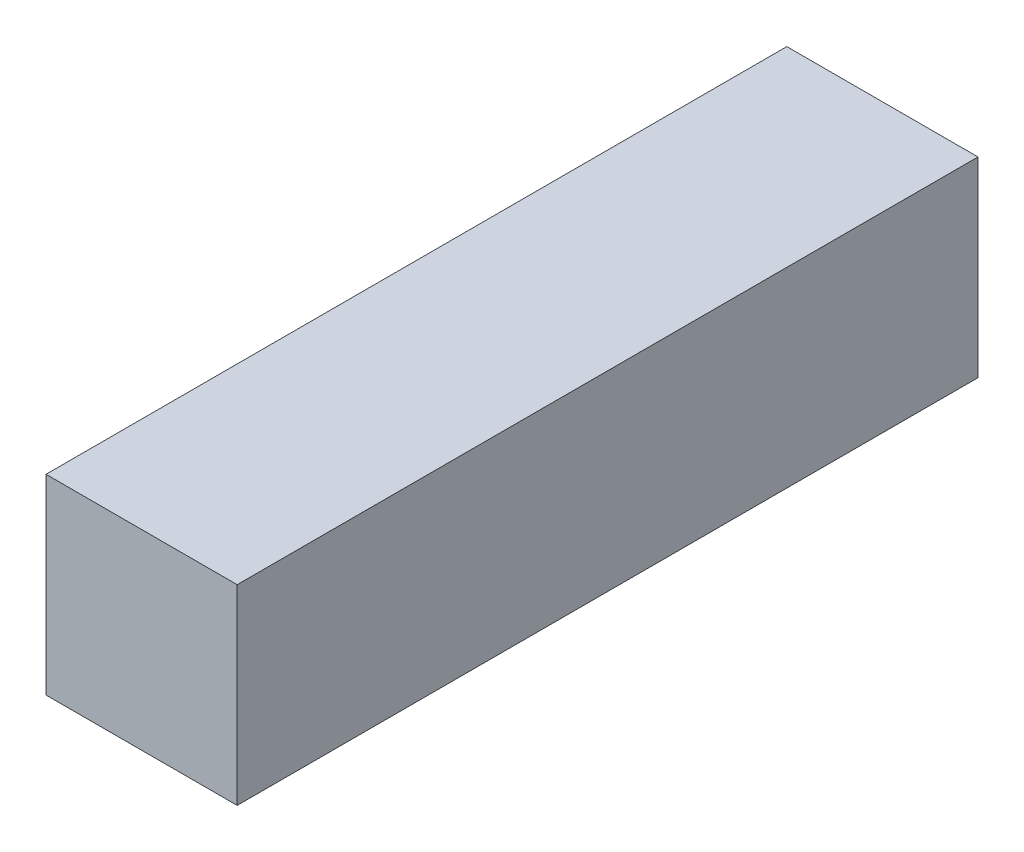
ISO-10303-21;
HEADER;
FILE_DESCRIPTION(('STEP AP214'),'2;1');
FILE_NAME('part.step','',(''),(''),'','','');
FILE_SCHEMA(('AUTOMOTIVE_DESIGN { 1 0 10303 214 1 1 1 1 }'));
ENDSEC;
DATA;
#1=APPLICATION_CONTEXT('core data for automotive mechanical design processes');
#2=APPLICATION_PROTOCOL_DEFINITION('international standard','automotive_design',2000,#1);
#3=PRODUCT_CONTEXT('',#1,'mechanical');
#4=PRODUCT('Part','Part','',(#3));
#5=PRODUCT_RELATED_PRODUCT_CATEGORY('part','',(#4));
#6=PRODUCT_DEFINITION_FORMATION('','',#4);
#7=PRODUCT_DEFINITION_CONTEXT('part definition',#1,'design');
#8=PRODUCT_DEFINITION('design','',#6,#7);
#9=PRODUCT_DEFINITION_SHAPE('','',#8);
#10=(LENGTH_UNIT() NAMED_UNIT(*) SI_UNIT(.MILLI.,.METRE.));
#11=(NAMED_UNIT(*) PLANE_ANGLE_UNIT() SI_UNIT($,.RADIAN.));
#12=(NAMED_UNIT(*) SI_UNIT($,.STERADIAN.) SOLID_ANGLE_UNIT());
#13=UNCERTAINTY_MEASURE_WITH_UNIT(LENGTH_MEASURE(1.E-05),#10,'distance_accuracy_value','');
#14=(GEOMETRIC_REPRESENTATION_CONTEXT(3) GLOBAL_UNCERTAINTY_ASSIGNED_CONTEXT((#13)) GLOBAL_UNIT_ASSIGNED_CONTEXT((#10,
#11,#12)) REPRESENTATION_CONTEXT('',''));
#15=CARTESIAN_POINT('',(0.,0.,0.));
#16=DIRECTION('',(0.,0.,1.));
#17=DIRECTION('',(1.,0.,0.));
#18=AXIS2_PLACEMENT_3D('',#15,#16,#17);
#19=CARTESIAN_POINT('',(-1.00000000000003,3.,-7.25));
#20=DIRECTION('',(-1.,0.,0.));
#21=DIRECTION('',(0.,0.,1.));
#22=AXIS2_PLACEMENT_3D('',#19,#20,#21);
#23=PLANE('',#22);
#24=DIRECTION('',(0.,-1.,0.));
#25=VECTOR('',#24,1.);
#26=CARTESIAN_POINT('',(-0.99999999999997,3.,7.25000000000001));
#27=LINE('',#26,#25);
#28=CARTESIAN_POINT('',(-0.99999999999997,3.,7.25000000000001));
#29=VERTEX_POINT('',#28);
#30=CARTESIAN_POINT('',(-0.99999999999997,0.25,7.25000000000001));
#31=VERTEX_POINT('',#30);
#32=EDGE_CURVE('E147',#29,#31,#27,.T.);
#33=ORIENTED_EDGE('',*,*,#32,.T.);
#34=DIRECTION('',(0.,0.,1.));
#35=VECTOR('',#34,1.);
#36=CARTESIAN_POINT('',(-0.99999999999997,0.25,7.25000000000001));
#37=LINE('',#36,#35);
#38=CARTESIAN_POINT('',(-1.00000000000003,0.25,-7.25));
#39=VERTEX_POINT('',#38);
#40=EDGE_CURVE('E134',#39,#31,#37,.T.);
#41=ORIENTED_EDGE('',*,*,#40,.F.);
#42=DIRECTION('',(0.,-1.,0.));
#43=VECTOR('',#42,1.);
#44=CARTESIAN_POINT('',(-1.00000000000003,3.,-7.25));
#45=LINE('',#44,#43);
#46=CARTESIAN_POINT('',(-1.00000000000003,3.,-7.25));
#47=VERTEX_POINT('',#46);
#48=EDGE_CURVE('E11',#47,#39,#45,.T.);
#49=ORIENTED_EDGE('',*,*,#48,.F.);
#50=DIRECTION('',(0.,0.,-1.));
#51=VECTOR('',#50,1.);
#52=CARTESIAN_POINT('',(-1.00000000000003,3.,-7.25));
#53=LINE('',#52,#51);
#54=EDGE_CURVE('E151',#29,#47,#53,.T.);
#55=ORIENTED_EDGE('',*,*,#54,.F.);
#56=EDGE_LOOP('',(#33,#41,#49,#55));
#57=FACE_BOUND('',#56,.T.);
#58=ADVANCED_FACE('F37',(#57),#23,.F.);
#59=CARTESIAN_POINT('',(-2.00000000000003,3.,-7.25));
#60=DIRECTION('',(1.,0.,0.));
#61=DIRECTION('',(0.,0.,-1.));
#62=AXIS2_PLACEMENT_3D('',#59,#60,#61);
#63=PLANE('',#62);
#64=DIRECTION('',(0.,0.,1.));
#65=VECTOR('',#64,1.);
#66=CARTESIAN_POINT('',(-2.00000000000003,0.,-7.25));
#67=LINE('',#66,#65);
#68=CARTESIAN_POINT('',(-2.00000000000003,0.,-7.25));
#69=VERTEX_POINT('',#68);
#70=CARTESIAN_POINT('',(-2.00000000000003,0.,8.25000000000001));
#71=VERTEX_POINT('',#70);
#72=EDGE_CURVE('E187',#69,#71,#67,.T.);
#73=ORIENTED_EDGE('',*,*,#72,.T.);
#74=DIRECTION('',(0.,-1.,0.));
#75=VECTOR('',#74,1.);
#76=CARTESIAN_POINT('',(-2.00000000000003,3.,8.25000000000001));
#77=LINE('',#76,#75);
#78=CARTESIAN_POINT('',(-2.00000000000003,4.,8.25000000000001));
#79=VERTEX_POINT('',#78);
#80=EDGE_CURVE('E166',#79,#71,#77,.T.);
#81=ORIENTED_EDGE('',*,*,#80,.F.);
#82=DIRECTION('',(0.,0.,1.));
#83=VECTOR('',#82,1.);
#84=CARTESIAN_POINT('',(-2.00000000000003,4.,8.25000000000001));
#85=LINE('',#84,#83);
#86=CARTESIAN_POINT('',(-2.00000000000003,4.,-7.25));
#87=VERTEX_POINT('',#86);
#88=EDGE_CURVE('E221',#87,#79,#85,.T.);
#89=ORIENTED_EDGE('',*,*,#88,.F.);
#90=DIRECTION('',(0.,-1.,0.));
#91=VECTOR('',#90,1.);
#92=CARTESIAN_POINT('',(-2.00000000000003,3.,-7.25));
#93=LINE('',#92,#91);
#94=EDGE_CURVE('E45',#87,#69,#93,.T.);
#95=ORIENTED_EDGE('',*,*,#94,.T.);
#96=EDGE_LOOP('',(#73,#81,#89,#95));
#97=FACE_BOUND('',#96,.T.);
#98=ADVANCED_FACE('F237',(#97),#63,.F.);
#99=CARTESIAN_POINT('',(2.00000000000003,3.,8.25000000000001));
#100=DIRECTION('',(0.,0.,-1.));
#101=DIRECTION('',(-1.,0.,0.));
#102=AXIS2_PLACEMENT_3D('',#99,#100,#101);
#103=PLANE('',#102);
#104=DIRECTION('',(1.,0.,0.));
#105=VECTOR('',#104,1.);
#106=CARTESIAN_POINT('',(2.00000000000003,0.,8.25000000000001));
#107=LINE('',#106,#105);
#108=CARTESIAN_POINT('',(2.00000000000003,0.,8.25000000000001));
#109=VERTEX_POINT('',#108);
#110=EDGE_CURVE('E191',#71,#109,#107,.T.);
#111=ORIENTED_EDGE('',*,*,#110,.T.);
#112=DIRECTION('',(0.,-1.,0.));
#113=VECTOR('',#112,1.);
#114=CARTESIAN_POINT('',(2.00000000000003,3.,8.25000000000001));
#115=LINE('',#114,#113);
#116=CARTESIAN_POINT('',(2.00000000000003,4.,8.25000000000001));
#117=VERTEX_POINT('',#116);
#118=EDGE_CURVE('E164',#117,#109,#115,.T.);
#119=ORIENTED_EDGE('',*,*,#118,.F.);
#120=DIRECTION('',(1.,0.,0.));
#121=VECTOR('',#120,1.);
#122=CARTESIAN_POINT('',(2.00000000000003,4.,8.25000000000001));
#123=LINE('',#122,#121);
#124=EDGE_CURVE('E224',#79,#117,#123,.T.);
#125=ORIENTED_EDGE('',*,*,#124,.F.);
#126=ORIENTED_EDGE('',*,*,#80,.T.);
#127=EDGE_LOOP('',(#111,#119,#125,#126));
#128=FACE_BOUND('',#127,.T.);
#129=ADVANCED_FACE('F241',(#128),#103,.F.);
#130=CARTESIAN_POINT('',(2.00000000000003,3.,7.25));
#131=DIRECTION('',(-1.,0.,0.));
#132=DIRECTION('',(0.,0.,1.));
#133=AXIS2_PLACEMENT_3D('',#130,#131,#132);
#134=PLANE('',#133);
#135=DIRECTION('',(0.,0.,-1.));
#136=VECTOR('',#135,1.);
#137=CARTESIAN_POINT('',(2.00000000000003,0.,7.25));
#138=LINE('',#137,#136);
#139=CARTESIAN_POINT('',(2.00000000000003,0.,-7.25));
#140=VERTEX_POINT('',#139);
#141=EDGE_CURVE('E82',#109,#140,#138,.T.);
#142=ORIENTED_EDGE('',*,*,#141,.T.);
#143=DIRECTION('',(0.,-1.,0.));
#144=VECTOR('',#143,1.);
#145=CARTESIAN_POINT('',(2.00000000000003,3.,-7.25));
#146=LINE('',#145,#144);
#147=CARTESIAN_POINT('',(2.00000000000003,4.,-7.25));
#148=VERTEX_POINT('',#147);
#149=EDGE_CURVE('E162',#148,#140,#146,.T.);
#150=ORIENTED_EDGE('',*,*,#149,.F.);
#151=DIRECTION('',(0.,0.,-1.));
#152=VECTOR('',#151,1.);
#153=CARTESIAN_POINT('',(2.00000000000003,4.,-7.25));
#154=LINE('',#153,#152);
#155=EDGE_CURVE('E227',#117,#148,#154,.T.);
#156=ORIENTED_EDGE('',*,*,#155,.F.);
#157=ORIENTED_EDGE('',*,*,#118,.T.);
#158=EDGE_LOOP('',(#142,#150,#156,#157));
#159=FACE_BOUND('',#158,.T.);
#160=ADVANCED_FACE('F242',(#159),#134,.F.);
#161=CARTESIAN_POINT('',(1.00000000000003,3.,-7.25));
#162=DIRECTION('',(0.,0.,1.));
#163=DIRECTION('',(1.,0.,0.));
#164=AXIS2_PLACEMENT_3D('',#161,#162,#163);
#165=PLANE('',#164);
#166=DIRECTION('',(-1.,0.,0.));
#167=VECTOR('',#166,1.);
#168=CARTESIAN_POINT('',(1.00000000000003,0.,-7.25));
#169=LINE('',#168,#167);
#170=CARTESIAN_POINT('',(1.50000000000003,0.,-7.25));
#171=VERTEX_POINT('',#170);
#172=EDGE_CURVE('E159',#140,#171,#169,.T.);
#173=ORIENTED_EDGE('',*,*,#172,.T.);
#174=DIRECTION('',(0.,-1.,0.));
#175=VECTOR('',#174,1.);
#176=CARTESIAN_POINT('',(1.50000000000003,0.25,-7.25));
#177=LINE('',#176,#175);
#178=CARTESIAN_POINT('',(1.50000000000003,0.25,-7.25));
#179=VERTEX_POINT('',#178);
#180=EDGE_CURVE('E52',#179,#171,#177,.T.);
#181=ORIENTED_EDGE('',*,*,#180,.F.);
#182=DIRECTION('',(1.,0.,0.));
#183=VECTOR('',#182,1.);
#184=CARTESIAN_POINT('',(1.00000000000003,0.25,-7.25));
#185=LINE('',#184,#183);
#186=CARTESIAN_POINT('',(1.00000000000003,0.25,-7.25));
#187=VERTEX_POINT('',#186);
#188=EDGE_CURVE('E375',#187,#179,#185,.T.);
#189=ORIENTED_EDGE('',*,*,#188,.F.);
#190=DIRECTION('',(0.,-1.,0.));
#191=VECTOR('',#190,1.);
#192=CARTESIAN_POINT('',(1.00000000000003,3.,-7.25));
#193=LINE('',#192,#191);
#194=CARTESIAN_POINT('',(1.00000000000003,3.,-7.25));
#195=VERTEX_POINT('',#194);
#196=EDGE_CURVE('E154',#195,#187,#193,.T.);
#197=ORIENTED_EDGE('',*,*,#196,.F.);
#198=DIRECTION('',(-1.,0.,0.));
#199=VECTOR('',#198,1.);
#200=CARTESIAN_POINT('',(-2.00000000000003,3.,-7.25));
#201=LINE('',#200,#199);
#202=EDGE_CURVE('E182',#195,#47,#201,.T.);
#203=ORIENTED_EDGE('',*,*,#202,.T.);
#204=ORIENTED_EDGE('',*,*,#48,.T.);
#205=DIRECTION('',(1.,0.,0.));
#206=VECTOR('',#205,1.);
#207=CARTESIAN_POINT('',(-1.00000000000003,0.25,-7.25));
#208=LINE('',#207,#206);
#209=CARTESIAN_POINT('',(-1.50000000000003,0.25,-7.25));
#210=VERTEX_POINT('',#209);
#211=EDGE_CURVE('E140',#210,#39,#208,.T.);
#212=ORIENTED_EDGE('',*,*,#211,.F.);
#213=DIRECTION('',(0.,-1.,0.));
#214=VECTOR('',#213,1.);
#215=CARTESIAN_POINT('',(-1.50000000000003,0.25,-7.25));
#216=LINE('',#215,#214);
#217=CARTESIAN_POINT('',(-1.50000000000003,0.,-7.25));
#218=VERTEX_POINT('',#217);
#219=EDGE_CURVE('E213',#210,#218,#216,.T.);
#220=ORIENTED_EDGE('',*,*,#219,.T.);
#221=DIRECTION('',(-1.,0.,0.));
#222=VECTOR('',#221,1.);
#223=CARTESIAN_POINT('',(-2.00000000000003,0.,-7.25));
#224=LINE('',#223,#222);
#225=EDGE_CURVE('E185',#218,#69,#224,.T.);
#226=ORIENTED_EDGE('',*,*,#225,.T.);
#227=ORIENTED_EDGE('',*,*,#94,.F.);
#228=DIRECTION('',(-1.,0.,0.));
#229=VECTOR('',#228,1.);
#230=CARTESIAN_POINT('',(-2.00000000000003,4.,-7.25));
#231=LINE('',#230,#229);
#232=EDGE_CURVE('E188',#148,#87,#231,.T.);
#233=ORIENTED_EDGE('',*,*,#232,.F.);
#234=ORIENTED_EDGE('',*,*,#149,.T.);
#235=EDGE_LOOP('',(#173,#181,#189,#197,#203,#204,#212,#220,#226,#227,#233,#234));
#236=FACE_BOUND('',#235,.T.);
#237=ADVANCED_FACE('F196',(#236),#165,.F.);
#238=CARTESIAN_POINT('',(1.00000000000003,3.,7.25));
#239=DIRECTION('',(1.,0.,0.));
#240=DIRECTION('',(0.,0.,-1.));
#241=AXIS2_PLACEMENT_3D('',#238,#239,#240);
#242=PLANE('',#241);
#243=ORIENTED_EDGE('',*,*,#196,.T.);
#244=DIRECTION('',(0.,0.,-1.));
#245=VECTOR('',#244,1.);
#246=CARTESIAN_POINT('',(1.00000000000003,0.25,7.25));
#247=LINE('',#246,#245);
#248=CARTESIAN_POINT('',(1.00000000000003,0.25,7.25));
#249=VERTEX_POINT('',#248);
#250=EDGE_CURVE('E149',#249,#187,#247,.T.);
#251=ORIENTED_EDGE('',*,*,#250,.F.);
#252=DIRECTION('',(0.,-1.,0.));
#253=VECTOR('',#252,1.);
#254=CARTESIAN_POINT('',(1.00000000000003,3.,7.25));
#255=LINE('',#254,#253);
#256=CARTESIAN_POINT('',(1.00000000000003,3.,7.25));
#257=VERTEX_POINT('',#256);
#258=EDGE_CURVE('E61',#257,#249,#255,.T.);
#259=ORIENTED_EDGE('',*,*,#258,.F.);
#260=DIRECTION('',(0.,0.,1.));
#261=VECTOR('',#260,1.);
#262=CARTESIAN_POINT('',(1.00000000000003,3.,7.25));
#263=LINE('',#262,#261);
#264=EDGE_CURVE('E156',#195,#257,#263,.T.);
#265=ORIENTED_EDGE('',*,*,#264,.F.);
#266=EDGE_LOOP('',(#243,#251,#259,#265));
#267=FACE_BOUND('',#266,.T.);
#268=ADVANCED_FACE('F249',(#267),#242,.F.);
#269=CARTESIAN_POINT('',(-0.99999999999997,3.,7.25000000000001));
#270=DIRECTION('',(0.,0.,1.));
#271=DIRECTION('',(1.,0.,0.));
#272=AXIS2_PLACEMENT_3D('',#269,#270,#271);
#273=PLANE('',#272);
#274=ORIENTED_EDGE('',*,*,#258,.T.);
#275=DIRECTION('',(1.,0.,0.));
#276=VECTOR('',#275,1.);
#277=CARTESIAN_POINT('',(-0.99999999999997,0.25,7.25000000000001));
#278=LINE('',#277,#276);
#279=EDGE_CURVE('E137',#31,#249,#278,.T.);
#280=ORIENTED_EDGE('',*,*,#279,.F.);
#281=ORIENTED_EDGE('',*,*,#32,.F.);
#282=DIRECTION('',(-1.,0.,0.));
#283=VECTOR('',#282,1.);
#284=CARTESIAN_POINT('',(-0.99999999999997,3.,7.25000000000001));
#285=LINE('',#284,#283);
#286=EDGE_CURVE('E152',#257,#29,#285,.T.);
#287=ORIENTED_EDGE('',*,*,#286,.F.);
#288=EDGE_LOOP('',(#274,#280,#281,#287));
#289=FACE_BOUND('',#288,.T.);
#290=ADVANCED_FACE('F146',(#289),#273,.F.);
#291=CARTESIAN_POINT('',(-0.99999999999997,0.,7.25000000000001));
#292=DIRECTION('',(0.,1.,0.));
#293=DIRECTION('',(0.,0.,1.));
#294=AXIS2_PLACEMENT_3D('',#291,#292,#293);
#295=PLANE('',#294);
#296=ORIENTED_EDGE('',*,*,#225,.F.);
#297=DIRECTION('',(0.,0.,-1.));
#298=VECTOR('',#297,1.);
#299=CARTESIAN_POINT('',(-1.50000000000003,0.,-7.25));
#300=LINE('',#299,#298);
#301=CARTESIAN_POINT('',(-1.50000000000003,0.,7.71720074208507));
#302=VERTEX_POINT('',#301);
#303=EDGE_CURVE('E142',#302,#218,#300,.T.);
#304=ORIENTED_EDGE('',*,*,#303,.F.);
#305=DIRECTION('',(-1.,0.,0.));
#306=VECTOR('',#305,1.);
#307=CARTESIAN_POINT('',(-1.50000000000003,0.,7.71720074208507));
#308=LINE('',#307,#306);
#309=CARTESIAN_POINT('',(1.50000000000003,0.,7.71720074208507));
#310=VERTEX_POINT('',#309);
#311=EDGE_CURVE('E206',#310,#302,#308,.T.);
#312=ORIENTED_EDGE('',*,*,#311,.F.);
#313=DIRECTION('',(0.,0.,1.));
#314=VECTOR('',#313,1.);
#315=CARTESIAN_POINT('',(1.50000000000003,0.,7.71720074208507));
#316=LINE('',#315,#314);
#317=EDGE_CURVE('E203',#171,#310,#316,.T.);
#318=ORIENTED_EDGE('',*,*,#317,.F.);
#319=ORIENTED_EDGE('',*,*,#172,.F.);
#320=ORIENTED_EDGE('',*,*,#141,.F.);
#321=ORIENTED_EDGE('',*,*,#110,.F.);
#322=ORIENTED_EDGE('',*,*,#72,.F.);
#323=EDGE_LOOP('',(#296,#304,#312,#318,#319,#320,#321,#322));
#324=FACE_BOUND('',#323,.T.);
#325=ADVANCED_FACE('F201',(#324),#295,.F.);
#326=CARTESIAN_POINT('',(-2.00000000000003,4.,-7.25));
#327=DIRECTION('',(0.,-1.,0.));
#328=DIRECTION('',(0.,0.,-1.));
#329=AXIS2_PLACEMENT_3D('',#326,#327,#328);
#330=PLANE('',#329);
#331=ORIENTED_EDGE('',*,*,#88,.T.);
#332=ORIENTED_EDGE('',*,*,#124,.T.);
#333=ORIENTED_EDGE('',*,*,#155,.T.);
#334=ORIENTED_EDGE('',*,*,#232,.T.);
#335=EDGE_LOOP('',(#331,#332,#333,#334));
#336=FACE_BOUND('',#335,.T.);
#337=ADVANCED_FACE('F234',(#336),#330,.F.);
#338=CARTESIAN_POINT('',(-2.00000000000003,3.,-7.25));
#339=DIRECTION('',(0.,-1.,0.));
#340=DIRECTION('',(0.,0.,-1.));
#341=AXIS2_PLACEMENT_3D('',#338,#339,#340);
#342=PLANE('',#341);
#343=ORIENTED_EDGE('',*,*,#286,.T.);
#344=ORIENTED_EDGE('',*,*,#54,.T.);
#345=ORIENTED_EDGE('',*,*,#202,.F.);
#346=ORIENTED_EDGE('',*,*,#264,.T.);
#347=EDGE_LOOP('',(#343,#344,#345,#346));
#348=FACE_BOUND('',#347,.T.);
#349=ADVANCED_FACE('F278',(#348),#342,.T.);
#350=CARTESIAN_POINT('',(-1.50000000000003,0.25,-7.25));
#351=DIRECTION('',(-1.,0.,0.));
#352=DIRECTION('',(0.,0.,1.));
#353=AXIS2_PLACEMENT_3D('',#350,#351,#352);
#354=PLANE('',#353);
#355=ORIENTED_EDGE('',*,*,#303,.T.);
#356=ORIENTED_EDGE('',*,*,#219,.F.);
#357=DIRECTION('',(0.,0.,-1.));
#358=VECTOR('',#357,1.);
#359=CARTESIAN_POINT('',(-1.50000000000003,0.25,-7.25));
#360=LINE('',#359,#358);
#361=CARTESIAN_POINT('',(-1.50000000000003,0.25,7.71720074208507));
#362=VERTEX_POINT('',#361);
#363=EDGE_CURVE('E367',#362,#210,#360,.T.);
#364=ORIENTED_EDGE('',*,*,#363,.F.);
#365=DIRECTION('',(0.,-1.,0.));
#366=VECTOR('',#365,1.);
#367=CARTESIAN_POINT('',(-1.50000000000003,0.25,7.71720074208507));
#368=LINE('',#367,#366);
#369=EDGE_CURVE('E216',#362,#302,#368,.T.);
#370=ORIENTED_EDGE('',*,*,#369,.T.);
#371=EDGE_LOOP('',(#355,#356,#364,#370));
#372=FACE_BOUND('',#371,.T.);
#373=ADVANCED_FACE('F287',(#372),#354,.F.);
#374=CARTESIAN_POINT('',(-1.50000000000003,0.25,7.71720074208507));
#375=DIRECTION('',(0.,0.,1.));
#376=DIRECTION('',(1.,0.,0.));
#377=AXIS2_PLACEMENT_3D('',#374,#375,#376);
#378=PLANE('',#377);
#379=ORIENTED_EDGE('',*,*,#311,.T.);
#380=ORIENTED_EDGE('',*,*,#369,.F.);
#381=DIRECTION('',(-1.,0.,0.));
#382=VECTOR('',#381,1.);
#383=CARTESIAN_POINT('',(-1.50000000000003,0.25,7.71720074208507));
#384=LINE('',#383,#382);
#385=CARTESIAN_POINT('',(1.50000000000003,0.25,7.71720074208507));
#386=VERTEX_POINT('',#385);
#387=EDGE_CURVE('E368',#386,#362,#384,.T.);
#388=ORIENTED_EDGE('',*,*,#387,.F.);
#389=DIRECTION('',(0.,-1.,0.));
#390=VECTOR('',#389,1.);
#391=CARTESIAN_POINT('',(1.50000000000003,0.25,7.71720074208507));
#392=LINE('',#391,#390);
#393=EDGE_CURVE('E218',#386,#310,#392,.T.);
#394=ORIENTED_EDGE('',*,*,#393,.T.);
#395=EDGE_LOOP('',(#379,#380,#388,#394));
#396=FACE_BOUND('',#395,.T.);
#397=ADVANCED_FACE('F333',(#396),#378,.F.);
#398=CARTESIAN_POINT('',(1.50000000000003,0.25,7.71720074208507));
#399=DIRECTION('',(1.,0.,0.));
#400=DIRECTION('',(0.,0.,-1.));
#401=AXIS2_PLACEMENT_3D('',#398,#399,#400);
#402=PLANE('',#401);
#403=ORIENTED_EDGE('',*,*,#317,.T.);
#404=ORIENTED_EDGE('',*,*,#393,.F.);
#405=DIRECTION('',(0.,0.,1.));
#406=VECTOR('',#405,1.);
#407=CARTESIAN_POINT('',(1.50000000000003,0.25,7.71720074208507));
#408=LINE('',#407,#406);
#409=EDGE_CURVE('E370',#179,#386,#408,.T.);
#410=ORIENTED_EDGE('',*,*,#409,.F.);
#411=ORIENTED_EDGE('',*,*,#180,.T.);
#412=EDGE_LOOP('',(#403,#404,#410,#411));
#413=FACE_BOUND('',#412,.T.);
#414=ADVANCED_FACE('F343',(#413),#402,.F.);
#415=CARTESIAN_POINT('',(-1.00000000000003,0.25,-7.25));
#416=DIRECTION('',(0.,1.,0.));
#417=DIRECTION('',(0.,0.,1.));
#418=AXIS2_PLACEMENT_3D('',#415,#416,#417);
#419=PLANE('',#418);
#420=ORIENTED_EDGE('',*,*,#40,.T.);
#421=ORIENTED_EDGE('',*,*,#279,.T.);
#422=ORIENTED_EDGE('',*,*,#250,.T.);
#423=ORIENTED_EDGE('',*,*,#188,.T.);
#424=ORIENTED_EDGE('',*,*,#409,.T.);
#425=ORIENTED_EDGE('',*,*,#387,.T.);
#426=ORIENTED_EDGE('',*,*,#363,.T.);
#427=ORIENTED_EDGE('',*,*,#211,.T.);
#428=EDGE_LOOP('',(#420,#421,#422,#423,#424,#425,#426,#427));
#429=FACE_BOUND('',#428,.T.);
#430=ADVANCED_FACE('F136',(#429),#419,.F.);
#431=CLOSED_SHELL('',(#58,#98,#129,#160,#237,#268,#290,#325,#337,#349,#373,#397,#414,#430));
#432=MANIFOLD_SOLID_BREP('B2',#431);
#433=ADVANCED_BREP_SHAPE_REPRESENTATION('',(#18,#432),#14);
#434=SHAPE_DEFINITION_REPRESENTATION(#9,#433);
ENDSEC;
END-ISO-10303-21;
